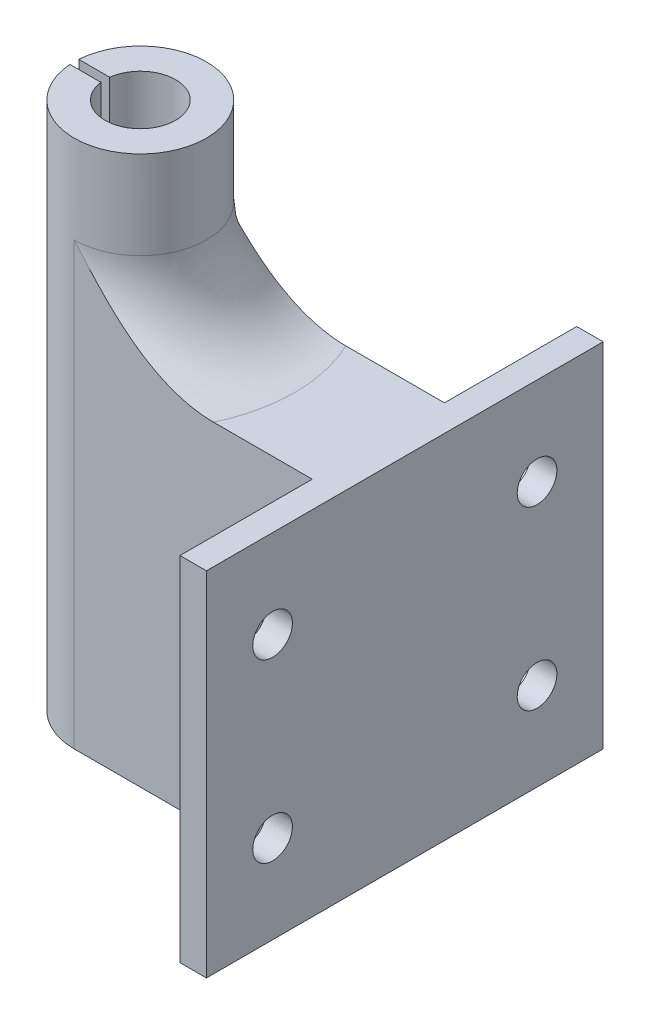
ISO-10303-21;
HEADER;
FILE_DESCRIPTION(('STEP AP214'),'2;1');
FILE_NAME('part.step','',(''),(''),'','','');
FILE_SCHEMA(('AUTOMOTIVE_DESIGN { 1 0 10303 214 1 1 1 1 }'));
ENDSEC;
DATA;
#1=APPLICATION_CONTEXT('core data for automotive mechanical design processes');
#2=APPLICATION_PROTOCOL_DEFINITION('international standard','automotive_design',2000,#1);
#3=PRODUCT_CONTEXT('',#1,'mechanical');
#4=PRODUCT('Part','Part','',(#3));
#5=PRODUCT_RELATED_PRODUCT_CATEGORY('part','',(#4));
#6=PRODUCT_DEFINITION_FORMATION('','',#4);
#7=PRODUCT_DEFINITION_CONTEXT('part definition',#1,'design');
#8=PRODUCT_DEFINITION('design','',#6,#7);
#9=PRODUCT_DEFINITION_SHAPE('','',#8);
#10=(LENGTH_UNIT() NAMED_UNIT(*) SI_UNIT(.MILLI.,.METRE.));
#11=(NAMED_UNIT(*) PLANE_ANGLE_UNIT() SI_UNIT($,.RADIAN.));
#12=(NAMED_UNIT(*) SI_UNIT($,.STERADIAN.) SOLID_ANGLE_UNIT());
#13=UNCERTAINTY_MEASURE_WITH_UNIT(LENGTH_MEASURE(1.E-05),#10,'distance_accuracy_value','');
#14=(GEOMETRIC_REPRESENTATION_CONTEXT(3) GLOBAL_UNCERTAINTY_ASSIGNED_CONTEXT((#13)) GLOBAL_UNIT_ASSIGNED_CONTEXT((#10,
#11,#12)) REPRESENTATION_CONTEXT('',''));
#15=CARTESIAN_POINT('',(0.,0.,0.));
#16=DIRECTION('',(0.,0.,1.));
#17=DIRECTION('',(1.,0.,0.));
#18=AXIS2_PLACEMENT_3D('',#15,#16,#17);
#19=CARTESIAN_POINT('',(19.,40.,15.));
#20=DIRECTION('',(0.,-1.,0.));
#21=DIRECTION('',(1.,0.,0.));
#22=AXIS2_PLACEMENT_3D('',#19,#20,#21);
#23=PLANE('',#22);
#24=DIRECTION('',(-1.,0.,0.));
#25=VECTOR('',#24,1.);
#26=CARTESIAN_POINT('',(19.,40.,0.));
#27=LINE('',#26,#25);
#28=CARTESIAN_POINT('',(-3.,40.,0.));
#29=VERTEX_POINT('',#28);
#30=CARTESIAN_POINT('',(-14.1886116991581,40.,0.));
#31=VERTEX_POINT('',#30);
#32=EDGE_CURVE('E249',#29,#31,#27,.T.);
#33=ORIENTED_EDGE('',*,*,#32,.T.);
#34=CARTESIAN_POINT('',(-30.,40.,7.5));
#35=DIRECTION('',(0.,-1.,0.));
#36=DIRECTION('',(1.,0.,0.));
#37=AXIS2_PLACEMENT_3D('',#34,#35,#36);
#38=CIRCLE('',#37,17.5);
#39=CARTESIAN_POINT('',(-14.1886116991581,40.,15.));
#40=VERTEX_POINT('',#39);
#41=EDGE_CURVE('E59',#31,#40,#38,.T.);
#42=ORIENTED_EDGE('',*,*,#41,.T.);
#43=DIRECTION('',(-1.,0.,0.));
#44=VECTOR('',#43,1.);
#45=CARTESIAN_POINT('',(19.,40.,15.));
#46=LINE('',#45,#44);
#47=CARTESIAN_POINT('',(-3.,40.,15.));
#48=VERTEX_POINT('',#47);
#49=EDGE_CURVE('E248',#48,#40,#46,.T.);
#50=ORIENTED_EDGE('',*,*,#49,.F.);
#51=DIRECTION('',(0.,0.,-1.));
#52=VECTOR('',#51,1.);
#53=CARTESIAN_POINT('',(-3.,40.,30.));
#54=LINE('',#53,#52);
#55=CARTESIAN_POINT('',(-3.,40.,30.));
#56=VERTEX_POINT('',#55);
#57=EDGE_CURVE('E231',#56,#48,#54,.T.);
#58=ORIENTED_EDGE('',*,*,#57,.F.);
#59=DIRECTION('',(-1.,0.,0.));
#60=VECTOR('',#59,1.);
#61=CARTESIAN_POINT('',(-3.,40.,30.));
#62=LINE('',#61,#60);
#63=CARTESIAN_POINT('',(0.,40.,30.));
#64=VERTEX_POINT('',#63);
#65=EDGE_CURVE('E217',#64,#56,#62,.T.);
#66=ORIENTED_EDGE('',*,*,#65,.F.);
#67=DIRECTION('',(0.,0.,-1.));
#68=VECTOR('',#67,1.);
#69=CARTESIAN_POINT('',(0.,40.,15.));
#70=LINE('',#69,#68);
#71=CARTESIAN_POINT('',(0.,40.,-15.));
#72=VERTEX_POINT('',#71);
#73=EDGE_CURVE('E172',#64,#72,#70,.T.);
#74=ORIENTED_EDGE('',*,*,#73,.T.);
#75=DIRECTION('',(1.,0.,0.));
#76=VECTOR('',#75,1.);
#77=CARTESIAN_POINT('',(19.,40.,-15.));
#78=LINE('',#77,#76);
#79=CARTESIAN_POINT('',(-3.,40.,-15.));
#80=VERTEX_POINT('',#79);
#81=EDGE_CURVE('E207',#80,#72,#78,.T.);
#82=ORIENTED_EDGE('',*,*,#81,.F.);
#83=DIRECTION('',(0.,0.,1.));
#84=VECTOR('',#83,1.);
#85=CARTESIAN_POINT('',(-3.,40.,-15.));
#86=LINE('',#85,#84);
#87=EDGE_CURVE('E210',#80,#29,#86,.T.);
#88=ORIENTED_EDGE('',*,*,#87,.T.);
#89=EDGE_LOOP('',(#33,#42,#50,#58,#66,#74,#82,#88));
#90=FACE_BOUND('',#89,.T.);
#91=ADVANCED_FACE('F33',(#90),#23,.F.);
#92=CARTESIAN_POINT('',(0.,0.,0.));
#93=DIRECTION('',(0.,0.,1.));
#94=DIRECTION('',(1.,0.,0.));
#95=AXIS2_PLACEMENT_3D('',#92,#93,#94);
#96=PLANE('',#95);
#97=DIRECTION('',(0.,1.,0.));
#98=VECTOR('',#97,1.);
#99=CARTESIAN_POINT('',(-3.,40.,0.));
#100=LINE('',#99,#98);
#101=CARTESIAN_POINT('',(-3.00000000000001,0.,0.));
#102=VERTEX_POINT('',#101);
#103=EDGE_CURVE('E199',#102,#29,#100,.T.);
#104=ORIENTED_EDGE('',*,*,#103,.F.);
#105=DIRECTION('',(1.,0.,0.));
#106=VECTOR('',#105,1.);
#107=CARTESIAN_POINT('',(-37.5,0.,0.));
#108=LINE('',#107,#106);
#109=CARTESIAN_POINT('',(-30.,0.,0.));
#110=VERTEX_POINT('',#109);
#111=EDGE_CURVE('E244',#110,#102,#108,.T.);
#112=ORIENTED_EDGE('',*,*,#111,.F.);
#113=DIRECTION('',(0.,-1.,0.));
#114=VECTOR('',#113,1.);
#115=CARTESIAN_POINT('',(-30.,0.,0.));
#116=LINE('',#115,#114);
#117=CARTESIAN_POINT('',(-30.,50.,0.));
#118=VERTEX_POINT('',#117);
#119=EDGE_CURVE('E153',#110,#118,#116,.F.);
#120=ORIENTED_EDGE('',*,*,#119,.T.);
#121=CARTESIAN_POINT('',(-14.1886116991581,40.,0.));
#122=CARTESIAN_POINT('',(-14.375542200829,39.9999991405528,0.));
#123=CARTESIAN_POINT('',(-14.5624419448032,40.0042793379331,0.));
#124=CARTESIAN_POINT('',(-14.9358401853079,40.0212136438332,0.));
#125=CARTESIAN_POINT('',(-15.122338727894,40.0338667333715,0.));
#126=CARTESIAN_POINT('',(-15.6802972495685,40.0840602522087,0.));
#127=CARTESIAN_POINT('',(-16.0507179154732,40.1338359543175,0.));
#128=CARTESIAN_POINT('',(-16.7825815776654,40.263595706485,0.));
#129=CARTESIAN_POINT('',(-17.1440760174291,40.3432946801851,0.));
#130=CARTESIAN_POINT('',(-17.8597527735076,40.530943335374,0.));
#131=CARTESIAN_POINT('',(-18.2139323241811,40.638903498386,0.));
#132=CARTESIAN_POINT('',(-19.017169942197,40.9168640217711,0.));
#133=CARTESIAN_POINT('',(-19.463157144829,41.0957671183512,0.));
#134=CARTESIAN_POINT('',(-20.3374453039962,41.4924405258275,0.));
#135=CARTESIAN_POINT('',(-20.7657421041011,41.710219907613,0.));
#136=CARTESIAN_POINT('',(-21.6046120618661,42.1802473690413,0.));
#137=CARTESIAN_POINT('',(-22.0151265346911,42.4325996000523,0.));
#138=CARTESIAN_POINT('',(-22.8169539483387,42.9662640820564,0.));
#139=CARTESIAN_POINT('',(-23.2082593918161,43.2475875099596,0.));
#140=CARTESIAN_POINT('',(-24.1910594116999,44.0022922925518,0.));
#141=CARTESIAN_POINT('',(-24.7689058106165,44.4934193825766,0.));
#142=CARTESIAN_POINT('',(-25.8858458607749,45.5178953497928,0.));
#143=CARTESIAN_POINT('',(-26.4249110924041,46.0512746007471,0.));
#144=CARTESIAN_POINT('',(-28.000268450592,47.6917037539222,0.));
#145=CARTESIAN_POINT('',(-28.9941869875627,48.8385906539812,0.));
#146=CARTESIAN_POINT('',(-29.9912713026664,49.9899209633091,0.));
#147=CARTESIAN_POINT('',(-29.9956356605678,49.994960489697,0.));
#148=CARTESIAN_POINT('',(-30.,50.,0.));
#149=B_SPLINE_CURVE_WITH_KNOTS('',3,(#121,#122,#123,#124,#125,#126,#127,#128,#129,#130,#131,
#132,#133,#134,#135,#136,#137,#138,#139,#140,#141,#142,#143,#144,#145,#146,#147,#148),
.UNSPECIFIED.,.F.,.F.,(4,2,2,2,2,2,2,2,2,2,2,2,2,4),(0.,0.560685643397134,1.1213030638614,
2.24104984652738,3.35038896797388,4.46014010598964,5.8995637963403,7.33932378322361,
8.78352056569878,10.2282766126549,12.5001767797029,14.7737252300947,19.3229152228889,
19.342915222889),.UNSPECIFIED.);
#150=EDGE_CURVE('E46',#118,#31,#149,.F.);
#151=ORIENTED_EDGE('',*,*,#150,.T.);
#152=ORIENTED_EDGE('',*,*,#32,.F.);
#153=EDGE_LOOP('',(#104,#112,#120,#151,#152));
#154=FACE_BOUND('',#153,.T.);
#155=ADVANCED_FACE('F274',(#154),#96,.F.);
#156=CARTESIAN_POINT('',(0.,0.,15.));
#157=DIRECTION('',(0.,0.,1.));
#158=DIRECTION('',(1.,0.,0.));
#159=AXIS2_PLACEMENT_3D('',#156,#157,#158);
#160=PLANE('',#159);
#161=DIRECTION('',(1.,0.,0.));
#162=VECTOR('',#161,1.);
#163=CARTESIAN_POINT('',(-37.5,0.,15.));
#164=LINE('',#163,#162);
#165=CARTESIAN_POINT('',(-30.,0.,15.));
#166=VERTEX_POINT('',#165);
#167=CARTESIAN_POINT('',(-3.,0.,15.));
#168=VERTEX_POINT('',#167);
#169=EDGE_CURVE('E246',#166,#168,#164,.T.);
#170=ORIENTED_EDGE('',*,*,#169,.T.);
#171=DIRECTION('',(0.,-1.,0.));
#172=VECTOR('',#171,1.);
#173=CARTESIAN_POINT('',(-3.,0.,15.));
#174=LINE('',#173,#172);
#175=EDGE_CURVE('E216',#48,#168,#174,.T.);
#176=ORIENTED_EDGE('',*,*,#175,.F.);
#177=ORIENTED_EDGE('',*,*,#49,.T.);
#178=CARTESIAN_POINT('',(-14.1886116991581,40.,15.));
#179=CARTESIAN_POINT('',(-14.375542200829,39.9999991405528,15.));
#180=CARTESIAN_POINT('',(-14.5624419448032,40.0042793379331,15.));
#181=CARTESIAN_POINT('',(-14.935840185308,40.0212136438332,15.));
#182=CARTESIAN_POINT('',(-15.1223387278942,40.0338667333715,15.));
#183=CARTESIAN_POINT('',(-15.6802972495687,40.0840602522087,15.));
#184=CARTESIAN_POINT('',(-16.0507179154734,40.1338359543175,15.));
#185=CARTESIAN_POINT('',(-16.7825815776657,40.2635957064851,15.));
#186=CARTESIAN_POINT('',(-17.1440760174293,40.3432946801851,15.));
#187=CARTESIAN_POINT('',(-17.8597527735077,40.5309433353741,15.));
#188=CARTESIAN_POINT('',(-18.2139323241812,40.6389034983861,15.));
#189=CARTESIAN_POINT('',(-19.017169942197,40.9168640217711,15.));
#190=CARTESIAN_POINT('',(-19.4631571448289,41.0957671183511,15.));
#191=CARTESIAN_POINT('',(-20.3374453039961,41.4924405258274,15.));
#192=CARTESIAN_POINT('',(-20.7657421041009,41.7102199076129,15.));
#193=CARTESIAN_POINT('',(-21.6046120618659,42.1802473690412,15.));
#194=CARTESIAN_POINT('',(-22.0151265346909,42.4325996000522,15.));
#195=CARTESIAN_POINT('',(-22.8169539483387,42.9662640820564,15.));
#196=CARTESIAN_POINT('',(-23.2082593918161,43.2475875099596,15.));
#197=CARTESIAN_POINT('',(-24.1910594116999,44.0022922925517,15.));
#198=CARTESIAN_POINT('',(-24.7689058106166,44.4934193825766,15.));
#199=CARTESIAN_POINT('',(-25.8858458607748,45.517895349793,15.));
#200=CARTESIAN_POINT('',(-26.4249110924039,46.0512746007475,15.));
#201=CARTESIAN_POINT('',(-28.0002684505927,47.6917037539217,15.));
#202=CARTESIAN_POINT('',(-28.9941869875662,48.8385906539782,14.9999999999999));
#203=CARTESIAN_POINT('',(-29.9912713026664,49.989920963309,15.));
#204=CARTESIAN_POINT('',(-29.9956356605678,49.994960489697,15.));
#205=CARTESIAN_POINT('',(-30.,50.,15.));
#206=B_SPLINE_CURVE_WITH_KNOTS('',3,(#178,#179,#180,#181,#182,#183,#184,#185,#186,#187,#188,
#189,#190,#191,#192,#193,#194,#195,#196,#197,#198,#199,#200,#201,#202,#203,#204,#205),
.UNSPECIFIED.,.F.,.F.,(4,2,2,2,2,2,2,2,2,2,2,2,2,4),(0.,0.560685643397205,1.12130306386154,
2.24104984652767,3.35038896797403,4.46014010598964,5.89956379634018,7.33932378322337,
8.78352056569865,10.2282766126549,12.5001767797029,14.7737252300948,19.3229152228888,
19.342915222889),.UNSPECIFIED.);
#207=CARTESIAN_POINT('',(-30.,50.,15.));
#208=VERTEX_POINT('',#207);
#209=EDGE_CURVE('E11',#40,#208,#206,.T.);
#210=ORIENTED_EDGE('',*,*,#209,.T.);
#211=DIRECTION('',(0.,-1.,0.));
#212=VECTOR('',#211,1.);
#213=CARTESIAN_POINT('',(-30.,0.,15.));
#214=LINE('',#213,#212);
#215=EDGE_CURVE('E263',#208,#166,#214,.T.);
#216=ORIENTED_EDGE('',*,*,#215,.T.);
#217=EDGE_LOOP('',(#170,#176,#177,#210,#216));
#218=FACE_BOUND('',#217,.T.);
#219=ADVANCED_FACE('F278',(#218),#160,.T.);
#220=CARTESIAN_POINT('',(-37.5,0.,15.));
#221=DIRECTION('',(0.,1.,0.));
#222=DIRECTION('',(0.,0.,1.));
#223=AXIS2_PLACEMENT_3D('',#220,#221,#222);
#224=PLANE('',#223);
#225=CARTESIAN_POINT('',(-30.,0.,7.5));
#226=DIRECTION('',(0.,1.,0.));
#227=DIRECTION('',(0.,0.,1.));
#228=AXIS2_PLACEMENT_3D('',#225,#226,#227);
#229=CIRCLE('',#228,7.5);
#230=CARTESIAN_POINT('',(-37.5,0.,7.5));
#231=VERTEX_POINT('',#230);
#232=EDGE_CURVE('E256',#166,#231,#229,.F.);
#233=ORIENTED_EDGE('',*,*,#232,.T.);
#234=CARTESIAN_POINT('',(-30.,0.,7.5));
#235=DIRECTION('',(0.,1.,0.));
#236=DIRECTION('',(0.,0.,1.));
#237=AXIS2_PLACEMENT_3D('',#234,#235,#236);
#238=CIRCLE('',#237,7.5);
#239=EDGE_CURVE('E258',#231,#110,#238,.F.);
#240=ORIENTED_EDGE('',*,*,#239,.T.);
#241=ORIENTED_EDGE('',*,*,#111,.T.);
#242=DIRECTION('',(0.,0.,1.));
#243=VECTOR('',#242,1.);
#244=CARTESIAN_POINT('',(-3.00000000000001,0.,-15.));
#245=LINE('',#244,#243);
#246=CARTESIAN_POINT('',(-3.00000000000001,0.,-15.));
#247=VERTEX_POINT('',#246);
#248=EDGE_CURVE('E214',#247,#102,#245,.T.);
#249=ORIENTED_EDGE('',*,*,#248,.F.);
#250=DIRECTION('',(-1.,0.,0.));
#251=VECTOR('',#250,1.);
#252=CARTESIAN_POINT('',(-3.00000000000001,0.,-15.));
#253=LINE('',#252,#251);
#254=CARTESIAN_POINT('',(0.,0.,-15.));
#255=VERTEX_POINT('',#254);
#256=EDGE_CURVE('E203',#255,#247,#253,.T.);
#257=ORIENTED_EDGE('',*,*,#256,.F.);
#258=DIRECTION('',(0.,0.,-1.));
#259=VECTOR('',#258,1.);
#260=CARTESIAN_POINT('',(0.,0.,15.));
#261=LINE('',#260,#259);
#262=CARTESIAN_POINT('',(0.,0.,30.));
#263=VERTEX_POINT('',#262);
#264=EDGE_CURVE('E251',#263,#255,#261,.T.);
#265=ORIENTED_EDGE('',*,*,#264,.F.);
#266=DIRECTION('',(1.,0.,0.));
#267=VECTOR('',#266,1.);
#268=CARTESIAN_POINT('',(0.,0.,30.));
#269=LINE('',#268,#267);
#270=CARTESIAN_POINT('',(-3.,0.,30.));
#271=VERTEX_POINT('',#270);
#272=EDGE_CURVE('E221',#271,#263,#269,.T.);
#273=ORIENTED_EDGE('',*,*,#272,.F.);
#274=DIRECTION('',(0.,0.,-1.));
#275=VECTOR('',#274,1.);
#276=CARTESIAN_POINT('',(-3.,0.,30.));
#277=LINE('',#276,#275);
#278=EDGE_CURVE('E226',#271,#168,#277,.T.);
#279=ORIENTED_EDGE('',*,*,#278,.T.);
#280=ORIENTED_EDGE('',*,*,#169,.F.);
#281=EDGE_LOOP('',(#233,#240,#241,#249,#257,#265,#273,#279,#280));
#282=FACE_BOUND('',#281,.T.);
#283=ADVANCED_FACE('F287',(#282),#224,.F.);
#284=CARTESIAN_POINT('',(0.,0.,15.));
#285=DIRECTION('',(-1.,0.,0.));
#286=DIRECTION('',(0.,0.,1.));
#287=AXIS2_PLACEMENT_3D('',#284,#285,#286);
#288=PLANE('',#287);
#289=CARTESIAN_POINT('',(0.,10.,22.5));
#290=DIRECTION('',(-1.,0.,0.));
#291=DIRECTION('',(0.,0.,1.));
#292=AXIS2_PLACEMENT_3D('',#289,#290,#291);
#293=CIRCLE('',#292,2.25);
#294=CARTESIAN_POINT('',(0.,10.,24.75));
#295=VERTEX_POINT('',#294);
#296=EDGE_CURVE('E178',#295,#295,#293,.F.);
#297=ORIENTED_EDGE('',*,*,#296,.F.);
#298=EDGE_LOOP('',(#297));
#299=FACE_BOUND('',#298,.T.);
#300=CARTESIAN_POINT('',(0.,30.,22.5));
#301=DIRECTION('',(-1.,0.,0.));
#302=DIRECTION('',(0.,0.,1.));
#303=AXIS2_PLACEMENT_3D('',#300,#301,#302);
#304=CIRCLE('',#303,2.25);
#305=CARTESIAN_POINT('',(0.,30.,24.75));
#306=VERTEX_POINT('',#305);
#307=EDGE_CURVE('E184',#306,#306,#304,.F.);
#308=ORIENTED_EDGE('',*,*,#307,.F.);
#309=EDGE_LOOP('',(#308));
#310=FACE_BOUND('',#309,.T.);
#311=CARTESIAN_POINT('',(0.,10.,-7.5));
#312=DIRECTION('',(-1.,0.,0.));
#313=DIRECTION('',(0.,0.,1.));
#314=AXIS2_PLACEMENT_3D('',#311,#312,#313);
#315=CIRCLE('',#314,2.25);
#316=CARTESIAN_POINT('',(0.,10.,-5.24999999999999));
#317=VERTEX_POINT('',#316);
#318=EDGE_CURVE('E190',#317,#317,#315,.T.);
#319=ORIENTED_EDGE('',*,*,#318,.T.);
#320=EDGE_LOOP('',(#319));
#321=FACE_BOUND('',#320,.T.);
#322=CARTESIAN_POINT('',(0.,30.,-7.5));
#323=DIRECTION('',(-1.,0.,0.));
#324=DIRECTION('',(0.,0.,1.));
#325=AXIS2_PLACEMENT_3D('',#322,#323,#324);
#326=CIRCLE('',#325,2.25);
#327=CARTESIAN_POINT('',(0.,30.,-5.25));
#328=VERTEX_POINT('',#327);
#329=EDGE_CURVE('E196',#328,#328,#326,.T.);
#330=ORIENTED_EDGE('',*,*,#329,.T.);
#331=EDGE_LOOP('',(#330));
#332=FACE_BOUND('',#331,.T.);
#333=ORIENTED_EDGE('',*,*,#264,.T.);
#334=DIRECTION('',(0.,-1.,0.));
#335=VECTOR('',#334,1.);
#336=CARTESIAN_POINT('',(0.,0.,-15.));
#337=LINE('',#336,#335);
#338=EDGE_CURVE('E200',#72,#255,#337,.T.);
#339=ORIENTED_EDGE('',*,*,#338,.F.);
#340=ORIENTED_EDGE('',*,*,#73,.F.);
#341=DIRECTION('',(0.,1.,0.));
#342=VECTOR('',#341,1.);
#343=CARTESIAN_POINT('',(0.,37.,30.));
#344=LINE('',#343,#342);
#345=EDGE_CURVE('E224',#263,#64,#344,.T.);
#346=ORIENTED_EDGE('',*,*,#345,.F.);
#347=EDGE_LOOP('',(#333,#339,#340,#346));
#348=FACE_BOUND('',#347,.T.);
#349=ADVANCED_FACE('F283',(#299,#310,#321,#332,#348),#288,.F.);
#350=CARTESIAN_POINT('',(-30.,20.,7.5));
#351=DIRECTION('',(0.,1.,0.));
#352=DIRECTION('',(-1.,0.,0.));
#353=AXIS2_PLACEMENT_3D('',#350,#351,#352);
#354=CYLINDRICAL_SURFACE('',#353,4.);
#355=DIRECTION('',(0.,1.,0.));
#356=VECTOR('',#355,1.);
#357=CARTESIAN_POINT('',(-33.9686269665969,20.,8.));
#358=LINE('',#357,#356);
#359=CARTESIAN_POINT('',(-33.9686269665969,20.,8.));
#360=VERTEX_POINT('',#359);
#361=CARTESIAN_POINT('',(-33.9686269665969,60.,8.));
#362=VERTEX_POINT('',#361);
#363=EDGE_CURVE('E242',#360,#362,#358,.T.);
#364=ORIENTED_EDGE('',*,*,#363,.T.);
#365=CARTESIAN_POINT('',(-30.,60.,7.5));
#366=DIRECTION('',(0.,-1.,0.));
#367=DIRECTION('',(-1.,0.,0.));
#368=AXIS2_PLACEMENT_3D('',#365,#366,#367);
#369=CIRCLE('',#368,4.);
#370=CARTESIAN_POINT('',(-33.9686269665969,60.,7.));
#371=VERTEX_POINT('',#370);
#372=EDGE_CURVE('E167',#371,#362,#369,.T.);
#373=ORIENTED_EDGE('',*,*,#372,.F.);
#374=DIRECTION('',(0.,1.,0.));
#375=VECTOR('',#374,1.);
#376=CARTESIAN_POINT('',(-33.9686269665969,20.,7.));
#377=LINE('',#376,#375);
#378=CARTESIAN_POINT('',(-33.9686269665969,20.,7.));
#379=VERTEX_POINT('',#378);
#380=EDGE_CURVE('E166',#379,#371,#377,.T.);
#381=ORIENTED_EDGE('',*,*,#380,.F.);
#382=CARTESIAN_POINT('',(-30.,20.,7.5));
#383=DIRECTION('',(0.,1.,0.));
#384=DIRECTION('',(-1.,0.,0.));
#385=AXIS2_PLACEMENT_3D('',#382,#383,#384);
#386=CIRCLE('',#385,4.);
#387=EDGE_CURVE('E235',#360,#379,#386,.T.);
#388=ORIENTED_EDGE('',*,*,#387,.F.);
#389=EDGE_LOOP('',(#364,#373,#381,#388));
#390=FACE_BOUND('',#389,.T.);
#391=ADVANCED_FACE('F286',(#390),#354,.F.);
#392=CARTESIAN_POINT('',(-37.5,20.,8.));
#393=DIRECTION('',(0.,0.,1.));
#394=DIRECTION('',(1.,0.,0.));
#395=AXIS2_PLACEMENT_3D('',#392,#393,#394);
#396=PLANE('',#395);
#397=DIRECTION('',(1.,0.,0.));
#398=VECTOR('',#397,1.);
#399=CARTESIAN_POINT('',(-37.5,20.,8.));
#400=LINE('',#399,#398);
#401=CARTESIAN_POINT('',(-37.4833147735479,20.,8.));
#402=VERTEX_POINT('',#401);
#403=EDGE_CURVE('E240',#402,#360,#400,.T.);
#404=ORIENTED_EDGE('',*,*,#403,.F.);
#405=DIRECTION('',(0.,1.,0.));
#406=VECTOR('',#405,1.);
#407=CARTESIAN_POINT('',(-37.4833147735479,20.,8.));
#408=LINE('',#407,#406);
#409=CARTESIAN_POINT('',(-37.4833147735479,60.,8.));
#410=VERTEX_POINT('',#409);
#411=EDGE_CURVE('E265',#402,#410,#408,.T.);
#412=ORIENTED_EDGE('',*,*,#411,.T.);
#413=DIRECTION('',(-1.,0.,0.));
#414=VECTOR('',#413,1.);
#415=CARTESIAN_POINT('',(-33.9686269665969,60.,8.));
#416=LINE('',#415,#414);
#417=EDGE_CURVE('E163',#362,#410,#416,.T.);
#418=ORIENTED_EDGE('',*,*,#417,.F.);
#419=ORIENTED_EDGE('',*,*,#363,.F.);
#420=EDGE_LOOP('',(#404,#412,#418,#419));
#421=FACE_BOUND('',#420,.T.);
#422=ADVANCED_FACE('F307',(#421),#396,.F.);
#423=CARTESIAN_POINT('',(-33.9686269665969,20.,7.));
#424=DIRECTION('',(0.,0.,-1.));
#425=DIRECTION('',(-1.,0.,0.));
#426=AXIS2_PLACEMENT_3D('',#423,#424,#425);
#427=PLANE('',#426);
#428=ORIENTED_EDGE('',*,*,#380,.T.);
#429=DIRECTION('',(1.,0.,0.));
#430=VECTOR('',#429,1.);
#431=CARTESIAN_POINT('',(-37.4833147735479,60.,7.));
#432=LINE('',#431,#430);
#433=CARTESIAN_POINT('',(-37.4833147735479,60.,7.));
#434=VERTEX_POINT('',#433);
#435=EDGE_CURVE('E160',#434,#371,#432,.T.);
#436=ORIENTED_EDGE('',*,*,#435,.F.);
#437=DIRECTION('',(0.,-1.,0.));
#438=VECTOR('',#437,1.);
#439=CARTESIAN_POINT('',(-37.4833147735479,40.,7.));
#440=LINE('',#439,#438);
#441=CARTESIAN_POINT('',(-37.4833147735479,20.,7.));
#442=VERTEX_POINT('',#441);
#443=EDGE_CURVE('E140',#434,#442,#440,.T.);
#444=ORIENTED_EDGE('',*,*,#443,.T.);
#445=DIRECTION('',(-1.,0.,0.));
#446=VECTOR('',#445,1.);
#447=CARTESIAN_POINT('',(-33.9686269665969,20.,7.));
#448=LINE('',#447,#446);
#449=EDGE_CURVE('E238',#379,#442,#448,.T.);
#450=ORIENTED_EDGE('',*,*,#449,.F.);
#451=EDGE_LOOP('',(#428,#436,#444,#450));
#452=FACE_BOUND('',#451,.T.);
#453=ADVANCED_FACE('F165',(#452),#427,.F.);
#454=CARTESIAN_POINT('',(-30.,20.,7.5));
#455=DIRECTION('',(0.,1.,0.));
#456=DIRECTION('',(-1.,0.,0.));
#457=AXIS2_PLACEMENT_3D('',#454,#455,#456);
#458=PLANE('',#457);
#459=ORIENTED_EDGE('',*,*,#449,.T.);
#460=CARTESIAN_POINT('',(-30.,20.,7.5));
#461=DIRECTION('',(0.,1.,0.));
#462=DIRECTION('',(-1.,0.,0.));
#463=AXIS2_PLACEMENT_3D('',#460,#461,#462);
#464=CIRCLE('',#463,7.5);
#465=CARTESIAN_POINT('',(-37.5,20.,7.5));
#466=VERTEX_POINT('',#465);
#467=EDGE_CURVE('E147',#442,#466,#464,.T.);
#468=ORIENTED_EDGE('',*,*,#467,.T.);
#469=CARTESIAN_POINT('',(-30.,20.,7.5));
#470=DIRECTION('',(0.,1.,0.));
#471=DIRECTION('',(-1.,0.,0.));
#472=AXIS2_PLACEMENT_3D('',#469,#470,#471);
#473=CIRCLE('',#472,7.5);
#474=EDGE_CURVE('E152',#466,#402,#473,.T.);
#475=ORIENTED_EDGE('',*,*,#474,.T.);
#476=ORIENTED_EDGE('',*,*,#403,.T.);
#477=ORIENTED_EDGE('',*,*,#387,.T.);
#478=EDGE_LOOP('',(#459,#468,#475,#476,#477));
#479=FACE_BOUND('',#478,.T.);
#480=ADVANCED_FACE('F293',(#479),#458,.T.);
#481=CARTESIAN_POINT('',(-30.,0.,7.5));
#482=DIRECTION('',(0.,1.,0.));
#483=DIRECTION('',(-1.,0.,0.));
#484=AXIS2_PLACEMENT_3D('',#481,#482,#483);
#485=CYLINDRICAL_SURFACE('',#484,7.5);
#486=CARTESIAN_POINT('',(-30.,50.,7.5));
#487=DIRECTION('',(0.,-1.,0.));
#488=DIRECTION('',(1.,0.,0.));
#489=AXIS2_PLACEMENT_3D('',#486,#487,#488);
#490=CIRCLE('',#489,7.5);
#491=EDGE_CURVE('E267',#208,#118,#490,.F.);
#492=ORIENTED_EDGE('',*,*,#491,.T.);
#493=ORIENTED_EDGE('',*,*,#119,.F.);
#494=ORIENTED_EDGE('',*,*,#239,.F.);
#495=DIRECTION('',(0.,-1.,0.));
#496=VECTOR('',#495,1.);
#497=CARTESIAN_POINT('',(-37.5,40.,7.5));
#498=LINE('',#497,#496);
#499=EDGE_CURVE('E234',#231,#466,#498,.F.);
#500=ORIENTED_EDGE('',*,*,#499,.T.);
#501=ORIENTED_EDGE('',*,*,#467,.F.);
#502=ORIENTED_EDGE('',*,*,#443,.F.);
#503=CARTESIAN_POINT('',(-30.,60.,7.5));
#504=DIRECTION('',(0.,1.,0.));
#505=DIRECTION('',(-1.,0.,0.));
#506=AXIS2_PLACEMENT_3D('',#503,#504,#505);
#507=CIRCLE('',#506,7.5);
#508=EDGE_CURVE('E145',#410,#434,#507,.T.);
#509=ORIENTED_EDGE('',*,*,#508,.F.);
#510=ORIENTED_EDGE('',*,*,#411,.F.);
#511=ORIENTED_EDGE('',*,*,#474,.F.);
#512=ORIENTED_EDGE('',*,*,#499,.F.);
#513=ORIENTED_EDGE('',*,*,#232,.F.);
#514=ORIENTED_EDGE('',*,*,#215,.F.);
#515=EDGE_LOOP('',(#492,#493,#494,#500,#501,#502,#509,#510,#511,#512,#513,#514));
#516=FACE_BOUND('',#515,.T.);
#517=ADVANCED_FACE('F143',(#516),#485,.T.);
#518=CARTESIAN_POINT('',(-3.,0.,30.));
#519=DIRECTION('',(1.,0.,0.));
#520=DIRECTION('',(0.,1.,0.));
#521=AXIS2_PLACEMENT_3D('',#518,#519,#520);
#522=PLANE('',#521);
#523=CARTESIAN_POINT('',(-3.00000000000001,10.,22.5));
#524=DIRECTION('',(1.,0.,0.));
#525=DIRECTION('',(0.,-1.,0.));
#526=AXIS2_PLACEMENT_3D('',#523,#524,#525);
#527=CIRCLE('',#526,2.25);
#528=CARTESIAN_POINT('',(-3.00000000000001,7.75,22.5));
#529=VERTEX_POINT('',#528);
#530=EDGE_CURVE('E175',#529,#529,#527,.T.);
#531=ORIENTED_EDGE('',*,*,#530,.T.);
#532=EDGE_LOOP('',(#531));
#533=FACE_BOUND('',#532,.T.);
#534=CARTESIAN_POINT('',(-3.,30.,22.5));
#535=DIRECTION('',(1.,0.,0.));
#536=DIRECTION('',(0.,-1.,0.));
#537=AXIS2_PLACEMENT_3D('',#534,#535,#536);
#538=CIRCLE('',#537,2.25);
#539=CARTESIAN_POINT('',(-3.,27.75,22.5));
#540=VERTEX_POINT('',#539);
#541=EDGE_CURVE('E181',#540,#540,#538,.T.);
#542=ORIENTED_EDGE('',*,*,#541,.T.);
#543=EDGE_LOOP('',(#542));
#544=FACE_BOUND('',#543,.T.);
#545=ORIENTED_EDGE('',*,*,#175,.T.);
#546=ORIENTED_EDGE('',*,*,#278,.F.);
#547=DIRECTION('',(0.,-1.,0.));
#548=VECTOR('',#547,1.);
#549=CARTESIAN_POINT('',(-3.,0.,30.));
#550=LINE('',#549,#548);
#551=EDGE_CURVE('E219',#56,#271,#550,.T.);
#552=ORIENTED_EDGE('',*,*,#551,.F.);
#553=ORIENTED_EDGE('',*,*,#57,.T.);
#554=EDGE_LOOP('',(#545,#546,#552,#553));
#555=FACE_BOUND('',#554,.T.);
#556=ADVANCED_FACE('F292',(#533,#544,#555),#522,.F.);
#557=CARTESIAN_POINT('',(0.,0.,30.));
#558=DIRECTION('',(0.,0.,-1.));
#559=DIRECTION('',(-1.,0.,0.));
#560=AXIS2_PLACEMENT_3D('',#557,#558,#559);
#561=PLANE('',#560);
#562=ORIENTED_EDGE('',*,*,#345,.T.);
#563=ORIENTED_EDGE('',*,*,#65,.T.);
#564=ORIENTED_EDGE('',*,*,#551,.T.);
#565=ORIENTED_EDGE('',*,*,#272,.T.);
#566=EDGE_LOOP('',(#562,#563,#564,#565));
#567=FACE_BOUND('',#566,.T.);
#568=ADVANCED_FACE('F299',(#567),#561,.F.);
#569=CARTESIAN_POINT('',(-3.,40.,-15.));
#570=DIRECTION('',(1.,0.,0.));
#571=DIRECTION('',(0.,1.,0.));
#572=AXIS2_PLACEMENT_3D('',#569,#570,#571);
#573=PLANE('',#572);
#574=CARTESIAN_POINT('',(-3.00000000000001,10.,-7.5));
#575=DIRECTION('',(-1.,0.,0.));
#576=DIRECTION('',(0.,-1.,0.));
#577=AXIS2_PLACEMENT_3D('',#574,#575,#576);
#578=CIRCLE('',#577,2.25);
#579=CARTESIAN_POINT('',(-3.00000000000001,7.75,-7.5));
#580=VERTEX_POINT('',#579);
#581=EDGE_CURVE('E187',#580,#580,#578,.T.);
#582=ORIENTED_EDGE('',*,*,#581,.F.);
#583=EDGE_LOOP('',(#582));
#584=FACE_BOUND('',#583,.T.);
#585=CARTESIAN_POINT('',(-3.,30.,-7.5));
#586=DIRECTION('',(-1.,0.,0.));
#587=DIRECTION('',(0.,-1.,0.));
#588=AXIS2_PLACEMENT_3D('',#585,#586,#587);
#589=CIRCLE('',#588,2.25);
#590=CARTESIAN_POINT('',(-3.,27.75,-7.5));
#591=VERTEX_POINT('',#590);
#592=EDGE_CURVE('E193',#591,#591,#589,.T.);
#593=ORIENTED_EDGE('',*,*,#592,.F.);
#594=EDGE_LOOP('',(#593));
#595=FACE_BOUND('',#594,.T.);
#596=ORIENTED_EDGE('',*,*,#103,.T.);
#597=ORIENTED_EDGE('',*,*,#87,.F.);
#598=DIRECTION('',(0.,1.,0.));
#599=VECTOR('',#598,1.);
#600=CARTESIAN_POINT('',(-3.,40.,-15.));
#601=LINE('',#600,#599);
#602=EDGE_CURVE('E205',#247,#80,#601,.T.);
#603=ORIENTED_EDGE('',*,*,#602,.F.);
#604=ORIENTED_EDGE('',*,*,#248,.T.);
#605=EDGE_LOOP('',(#596,#597,#603,#604));
#606=FACE_BOUND('',#605,.T.);
#607=ADVANCED_FACE('F332',(#584,#595,#606),#573,.F.);
#608=CARTESIAN_POINT('',(0.,0.,-15.));
#609=DIRECTION('',(0.,0.,1.));
#610=DIRECTION('',(1.,0.,0.));
#611=AXIS2_PLACEMENT_3D('',#608,#609,#610);
#612=PLANE('',#611);
#613=ORIENTED_EDGE('',*,*,#81,.T.);
#614=ORIENTED_EDGE('',*,*,#338,.T.);
#615=ORIENTED_EDGE('',*,*,#256,.T.);
#616=ORIENTED_EDGE('',*,*,#602,.T.);
#617=EDGE_LOOP('',(#613,#614,#615,#616));
#618=FACE_BOUND('',#617,.T.);
#619=ADVANCED_FACE('F338',(#618),#612,.F.);
#620=CARTESIAN_POINT('',(12.,30.,-7.5));
#621=DIRECTION('',(-1.,0.,0.));
#622=DIRECTION('',(0.,-1.,0.));
#623=AXIS2_PLACEMENT_3D('',#620,#621,#622);
#624=CYLINDRICAL_SURFACE('',#623,2.25);
#625=ORIENTED_EDGE('',*,*,#592,.T.);
#626=EDGE_LOOP('',(#625));
#627=FACE_BOUND('',#626,.T.);
#628=ORIENTED_EDGE('',*,*,#329,.F.);
#629=EDGE_LOOP('',(#628));
#630=FACE_BOUND('',#629,.T.);
#631=ADVANCED_FACE('F370',(#627,#630),#624,.F.);
#632=CARTESIAN_POINT('',(12.,10.,-7.5));
#633=DIRECTION('',(-1.,0.,0.));
#634=DIRECTION('',(0.,-1.,0.));
#635=AXIS2_PLACEMENT_3D('',#632,#633,#634);
#636=CYLINDRICAL_SURFACE('',#635,2.25);
#637=ORIENTED_EDGE('',*,*,#581,.T.);
#638=EDGE_LOOP('',(#637));
#639=FACE_BOUND('',#638,.T.);
#640=ORIENTED_EDGE('',*,*,#318,.F.);
#641=EDGE_LOOP('',(#640));
#642=FACE_BOUND('',#641,.T.);
#643=ADVANCED_FACE('F366',(#639,#642),#636,.F.);
#644=CARTESIAN_POINT('',(12.,30.,22.5));
#645=DIRECTION('',(-1.,0.,0.));
#646=DIRECTION('',(0.,-1.,0.));
#647=AXIS2_PLACEMENT_3D('',#644,#645,#646);
#648=CYLINDRICAL_SURFACE('',#647,2.25);
#649=ORIENTED_EDGE('',*,*,#541,.F.);
#650=EDGE_LOOP('',(#649));
#651=FACE_BOUND('',#650,.T.);
#652=ORIENTED_EDGE('',*,*,#307,.T.);
#653=EDGE_LOOP('',(#652));
#654=FACE_BOUND('',#653,.T.);
#655=ADVANCED_FACE('F360',(#651,#654),#648,.F.);
#656=CARTESIAN_POINT('',(12.,10.,22.5));
#657=DIRECTION('',(-1.,0.,0.));
#658=DIRECTION('',(0.,-1.,0.));
#659=AXIS2_PLACEMENT_3D('',#656,#657,#658);
#660=CYLINDRICAL_SURFACE('',#659,2.25);
#661=ORIENTED_EDGE('',*,*,#530,.F.);
#662=EDGE_LOOP('',(#661));
#663=FACE_BOUND('',#662,.T.);
#664=ORIENTED_EDGE('',*,*,#296,.T.);
#665=EDGE_LOOP('',(#664));
#666=FACE_BOUND('',#665,.T.);
#667=ADVANCED_FACE('F355',(#663,#666),#660,.F.);
#668=CARTESIAN_POINT('',(-30.,60.,7.5));
#669=DIRECTION('',(0.,1.,0.));
#670=DIRECTION('',(-1.,0.,0.));
#671=AXIS2_PLACEMENT_3D('',#668,#669,#670);
#672=PLANE('',#671);
#673=ORIENTED_EDGE('',*,*,#508,.T.);
#674=ORIENTED_EDGE('',*,*,#435,.T.);
#675=ORIENTED_EDGE('',*,*,#372,.T.);
#676=ORIENTED_EDGE('',*,*,#417,.T.);
#677=EDGE_LOOP('',(#673,#674,#675,#676));
#678=FACE_BOUND('',#677,.T.);
#679=ADVANCED_FACE('F158',(#678),#672,.T.);
#680=CARTESIAN_POINT('',(-30.,50.,7.5));
#681=DIRECTION('',(0.,-1.,0.));
#682=DIRECTION('',(1.,0.,0.));
#683=AXIS2_PLACEMENT_3D('',#680,#681,#682);
#684=TOROIDAL_SURFACE('',#683,17.5,10.);
#685=ORIENTED_EDGE('',*,*,#209,.F.);
#686=ORIENTED_EDGE('',*,*,#41,.F.);
#687=ORIENTED_EDGE('',*,*,#150,.F.);
#688=ORIENTED_EDGE('',*,*,#491,.F.);
#689=EDGE_LOOP('',(#685,#686,#687,#688));
#690=FACE_BOUND('',#689,.T.);
#691=ADVANCED_FACE('F35',(#690),#684,.F.);
#692=CLOSED_SHELL('',(#91,#155,#219,#283,#349,#391,#422,#453,#480,#517,#556,#568,#607,#619,#631,
#643,#655,#667,#679,#691));
#693=MANIFOLD_SOLID_BREP('B2',#692);
#694=ADVANCED_BREP_SHAPE_REPRESENTATION('',(#18,#693),#14);
#695=SHAPE_DEFINITION_REPRESENTATION(#9,#694);
ENDSEC;
END-ISO-10303-21;
